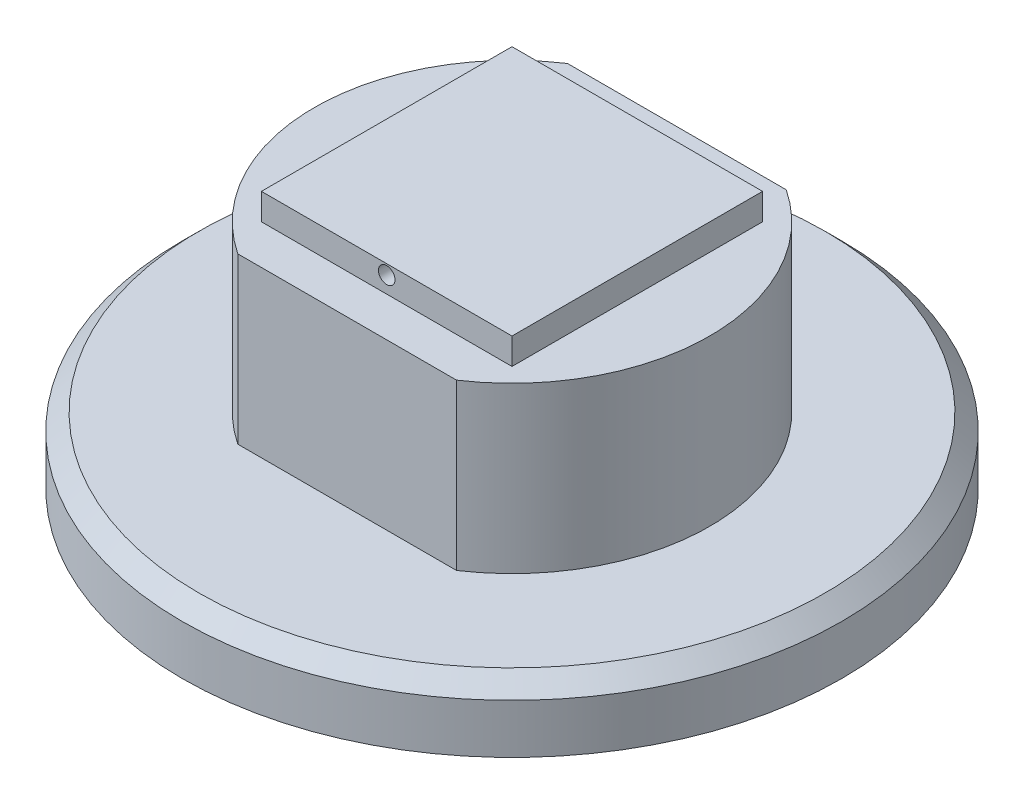
ISO-10303-21;
HEADER;
FILE_DESCRIPTION(('STEP AP214'),'2;1');
FILE_NAME('part.step','',(''),(''),'','','');
FILE_SCHEMA(('AUTOMOTIVE_DESIGN { 1 0 10303 214 1 1 1 1 }'));
ENDSEC;
DATA;
#1=APPLICATION_CONTEXT('core data for automotive mechanical design processes');
#2=APPLICATION_PROTOCOL_DEFINITION('international standard','automotive_design',2000,#1);
#3=PRODUCT_CONTEXT('',#1,'mechanical');
#4=PRODUCT('Part','Part','',(#3));
#5=PRODUCT_RELATED_PRODUCT_CATEGORY('part','',(#4));
#6=PRODUCT_DEFINITION_FORMATION('','',#4);
#7=PRODUCT_DEFINITION_CONTEXT('part definition',#1,'design');
#8=PRODUCT_DEFINITION('design','',#6,#7);
#9=PRODUCT_DEFINITION_SHAPE('','',#8);
#10=(LENGTH_UNIT() NAMED_UNIT(*) SI_UNIT(.MILLI.,.METRE.));
#11=(NAMED_UNIT(*) PLANE_ANGLE_UNIT() SI_UNIT($,.RADIAN.));
#12=(NAMED_UNIT(*) SI_UNIT($,.STERADIAN.) SOLID_ANGLE_UNIT());
#13=UNCERTAINTY_MEASURE_WITH_UNIT(LENGTH_MEASURE(1.E-05),#10,'distance_accuracy_value','');
#14=(GEOMETRIC_REPRESENTATION_CONTEXT(3) GLOBAL_UNCERTAINTY_ASSIGNED_CONTEXT((#13)) GLOBAL_UNIT_ASSIGNED_CONTEXT((#10,
#11,#12)) REPRESENTATION_CONTEXT('',''));
#15=CARTESIAN_POINT('',(0.,0.,0.));
#16=DIRECTION('',(0.,0.,1.));
#17=DIRECTION('',(1.,0.,0.));
#18=AXIS2_PLACEMENT_3D('',#15,#16,#17);
#19=CARTESIAN_POINT('',(0.,5.,0.));
#20=DIRECTION('',(0.,1.,0.));
#21=DIRECTION('',(0.,0.,1.));
#22=AXIS2_PLACEMENT_3D('',#19,#20,#21);
#23=PLANE('',#22);
#24=CARTESIAN_POINT('',(0.,5.,0.));
#25=DIRECTION('',(0.,1.,0.));
#26=DIRECTION('',(0.,0.,1.));
#27=AXIS2_PLACEMENT_3D('',#24,#25,#26);
#28=CIRCLE('',#27,6.);
#29=CARTESIAN_POINT('',(-3.3166247903554,5.,-5.));
#30=VERTEX_POINT('',#29);
#31=CARTESIAN_POINT('',(-3.3166247903554,5.,5.));
#32=VERTEX_POINT('',#31);
#33=EDGE_CURVE('E102',#30,#32,#28,.T.);
#34=ORIENTED_EDGE('',*,*,#33,.T.);
#35=DIRECTION('',(1.,0.,0.));
#36=VECTOR('',#35,1.);
#37=CARTESIAN_POINT('',(-3.3166247903554,5.,5.));
#38=LINE('',#37,#36);
#39=CARTESIAN_POINT('',(3.3166247903554,5.,5.));
#40=VERTEX_POINT('',#39);
#41=EDGE_CURVE('E95',#32,#40,#38,.T.);
#42=ORIENTED_EDGE('',*,*,#41,.T.);
#43=CARTESIAN_POINT('',(0.,5.,0.));
#44=DIRECTION('',(0.,1.,0.));
#45=DIRECTION('',(0.,0.,1.));
#46=AXIS2_PLACEMENT_3D('',#43,#44,#45);
#47=CIRCLE('',#46,6.);
#48=CARTESIAN_POINT('',(3.3166247903554,5.,-5.));
#49=VERTEX_POINT('',#48);
#50=EDGE_CURVE('E99',#40,#49,#47,.T.);
#51=ORIENTED_EDGE('',*,*,#50,.T.);
#52=DIRECTION('',(-1.,0.,0.));
#53=VECTOR('',#52,1.);
#54=CARTESIAN_POINT('',(-3.3166247903554,5.,-5.));
#55=LINE('',#54,#53);
#56=EDGE_CURVE('E56',#49,#30,#55,.T.);
#57=ORIENTED_EDGE('',*,*,#56,.T.);
#58=EDGE_LOOP('',(#34,#42,#51,#57));
#59=FACE_BOUND('',#58,.T.);
#60=DIRECTION('',(1.,0.,0.));
#61=VECTOR('',#60,1.);
#62=CARTESIAN_POINT('',(-3.8,5.,3.8));
#63=LINE('',#62,#61);
#64=CARTESIAN_POINT('',(-3.8,5.,3.8));
#65=VERTEX_POINT('',#64);
#66=CARTESIAN_POINT('',(3.8,5.,3.8));
#67=VERTEX_POINT('',#66);
#68=EDGE_CURVE('E305',#65,#67,#63,.T.);
#69=ORIENTED_EDGE('',*,*,#68,.F.);
#70=DIRECTION('',(0.,0.,1.));
#71=VECTOR('',#70,1.);
#72=CARTESIAN_POINT('',(-3.8,5.,-3.8));
#73=LINE('',#72,#71);
#74=CARTESIAN_POINT('',(-3.8,5.,-3.8));
#75=VERTEX_POINT('',#74);
#76=EDGE_CURVE('E138',#75,#65,#73,.T.);
#77=ORIENTED_EDGE('',*,*,#76,.F.);
#78=DIRECTION('',(-1.,0.,0.));
#79=VECTOR('',#78,1.);
#80=CARTESIAN_POINT('',(3.8,5.,-3.8));
#81=LINE('',#80,#79);
#82=CARTESIAN_POINT('',(3.8,5.,-3.8));
#83=VERTEX_POINT('',#82);
#84=EDGE_CURVE('E318',#83,#75,#81,.T.);
#85=ORIENTED_EDGE('',*,*,#84,.F.);
#86=DIRECTION('',(0.,0.,-1.));
#87=VECTOR('',#86,1.);
#88=CARTESIAN_POINT('',(3.8,5.,-3.8));
#89=LINE('',#88,#87);
#90=EDGE_CURVE('E316',#67,#83,#89,.T.);
#91=ORIENTED_EDGE('',*,*,#90,.F.);
#92=EDGE_LOOP('',(#69,#77,#85,#91));
#93=FACE_BOUND('',#92,.T.);
#94=ADVANCED_FACE('F32',(#59,#93),#23,.T.);
#95=CARTESIAN_POINT('',(0.,5.,0.));
#96=DIRECTION('',(0.,-1.,0.));
#97=DIRECTION('',(0.,0.,-1.));
#98=AXIS2_PLACEMENT_3D('',#95,#96,#97);
#99=CYLINDRICAL_SURFACE('',#98,6.);
#100=CARTESIAN_POINT('',(0.,0.,0.));
#101=DIRECTION('',(0.,1.,0.));
#102=DIRECTION('',(0.,0.,1.));
#103=AXIS2_PLACEMENT_3D('',#100,#101,#102);
#104=CIRCLE('',#103,6.);
#105=CARTESIAN_POINT('',(-3.3166247903554,0.,-5.));
#106=VERTEX_POINT('',#105);
#107=CARTESIAN_POINT('',(-3.3166247903554,0.,5.));
#108=VERTEX_POINT('',#107);
#109=EDGE_CURVE('E69',#106,#108,#104,.T.);
#110=ORIENTED_EDGE('',*,*,#109,.T.);
#111=DIRECTION('',(0.,-1.,0.));
#112=VECTOR('',#111,1.);
#113=CARTESIAN_POINT('',(-3.3166247903554,5.,5.));
#114=LINE('',#113,#112);
#115=EDGE_CURVE('E115',#32,#108,#114,.T.);
#116=ORIENTED_EDGE('',*,*,#115,.F.);
#117=ORIENTED_EDGE('',*,*,#33,.F.);
#118=DIRECTION('',(0.,-1.,0.));
#119=VECTOR('',#118,1.);
#120=CARTESIAN_POINT('',(-3.3166247903554,5.,-5.));
#121=LINE('',#120,#119);
#122=EDGE_CURVE('E121',#30,#106,#121,.T.);
#123=ORIENTED_EDGE('',*,*,#122,.T.);
#124=EDGE_LOOP('',(#110,#116,#117,#123));
#125=FACE_BOUND('',#124,.T.);
#126=ADVANCED_FACE('F156',(#125),#99,.T.);
#127=CARTESIAN_POINT('',(-3.3166247903554,5.,5.));
#128=DIRECTION('',(0.,0.,-1.));
#129=DIRECTION('',(-1.,0.,0.));
#130=AXIS2_PLACEMENT_3D('',#127,#128,#129);
#131=PLANE('',#130);
#132=DIRECTION('',(1.,0.,0.));
#133=VECTOR('',#132,1.);
#134=CARTESIAN_POINT('',(-3.3166247903554,0.,5.));
#135=LINE('',#134,#133);
#136=CARTESIAN_POINT('',(3.3166247903554,0.,5.));
#137=VERTEX_POINT('',#136);
#138=EDGE_CURVE('E112',#108,#137,#135,.T.);
#139=ORIENTED_EDGE('',*,*,#138,.T.);
#140=DIRECTION('',(0.,-1.,0.));
#141=VECTOR('',#140,1.);
#142=CARTESIAN_POINT('',(3.3166247903554,5.,5.));
#143=LINE('',#142,#141);
#144=EDGE_CURVE('E109',#40,#137,#143,.T.);
#145=ORIENTED_EDGE('',*,*,#144,.F.);
#146=ORIENTED_EDGE('',*,*,#41,.F.);
#147=ORIENTED_EDGE('',*,*,#115,.T.);
#148=EDGE_LOOP('',(#139,#145,#146,#147));
#149=FACE_BOUND('',#148,.T.);
#150=ADVANCED_FACE('F110',(#149),#131,.F.);
#151=CARTESIAN_POINT('',(0.,5.,0.));
#152=DIRECTION('',(0.,-1.,0.));
#153=DIRECTION('',(0.,0.,-1.));
#154=AXIS2_PLACEMENT_3D('',#151,#152,#153);
#155=CYLINDRICAL_SURFACE('',#154,6.);
#156=CARTESIAN_POINT('',(0.,0.,0.));
#157=DIRECTION('',(0.,1.,0.));
#158=DIRECTION('',(0.,0.,1.));
#159=AXIS2_PLACEMENT_3D('',#156,#157,#158);
#160=CIRCLE('',#159,6.);
#161=CARTESIAN_POINT('',(3.3166247903554,0.,-5.));
#162=VERTEX_POINT('',#161);
#163=EDGE_CURVE('E128',#137,#162,#160,.T.);
#164=ORIENTED_EDGE('',*,*,#163,.T.);
#165=DIRECTION('',(0.,-1.,0.));
#166=VECTOR('',#165,1.);
#167=CARTESIAN_POINT('',(3.3166247903554,5.,-5.));
#168=LINE('',#167,#166);
#169=EDGE_CURVE('E116',#49,#162,#168,.T.);
#170=ORIENTED_EDGE('',*,*,#169,.F.);
#171=ORIENTED_EDGE('',*,*,#50,.F.);
#172=ORIENTED_EDGE('',*,*,#144,.T.);
#173=EDGE_LOOP('',(#164,#170,#171,#172));
#174=FACE_BOUND('',#173,.T.);
#175=ADVANCED_FACE('F118',(#174),#155,.T.);
#176=CARTESIAN_POINT('',(-3.3166247903554,5.,-5.));
#177=DIRECTION('',(0.,0.,1.));
#178=DIRECTION('',(1.,0.,0.));
#179=AXIS2_PLACEMENT_3D('',#176,#177,#178);
#180=PLANE('',#179);
#181=DIRECTION('',(-1.,0.,0.));
#182=VECTOR('',#181,1.);
#183=CARTESIAN_POINT('',(-3.3166247903554,0.,-5.));
#184=LINE('',#183,#182);
#185=EDGE_CURVE('E130',#162,#106,#184,.T.);
#186=ORIENTED_EDGE('',*,*,#185,.T.);
#187=ORIENTED_EDGE('',*,*,#122,.F.);
#188=ORIENTED_EDGE('',*,*,#56,.F.);
#189=ORIENTED_EDGE('',*,*,#169,.T.);
#190=EDGE_LOOP('',(#186,#187,#188,#189));
#191=FACE_BOUND('',#190,.T.);
#192=ADVANCED_FACE('F166',(#191),#180,.F.);
#193=CARTESIAN_POINT('',(-3.8,5.8,-3.8));
#194=DIRECTION('',(1.,0.,0.));
#195=DIRECTION('',(0.,0.,-1.));
#196=AXIS2_PLACEMENT_3D('',#193,#194,#195);
#197=PLANE('',#196);
#198=ORIENTED_EDGE('',*,*,#76,.T.);
#199=DIRECTION('',(0.,-1.,0.));
#200=VECTOR('',#199,1.);
#201=CARTESIAN_POINT('',(-3.8,5.8,3.8));
#202=LINE('',#201,#200);
#203=CARTESIAN_POINT('',(-3.8,5.8,3.8));
#204=VERTEX_POINT('',#203);
#205=EDGE_CURVE('E126',#204,#65,#202,.T.);
#206=ORIENTED_EDGE('',*,*,#205,.F.);
#207=DIRECTION('',(0.,0.,1.));
#208=VECTOR('',#207,1.);
#209=CARTESIAN_POINT('',(-3.8,5.8,-3.8));
#210=LINE('',#209,#208);
#211=CARTESIAN_POINT('',(-3.8,5.8,-3.8));
#212=VERTEX_POINT('',#211);
#213=EDGE_CURVE('E298',#212,#204,#210,.T.);
#214=ORIENTED_EDGE('',*,*,#213,.F.);
#215=DIRECTION('',(0.,-1.,0.));
#216=VECTOR('',#215,1.);
#217=CARTESIAN_POINT('',(-3.8,5.8,-3.8));
#218=LINE('',#217,#216);
#219=EDGE_CURVE('E309',#212,#75,#218,.T.);
#220=ORIENTED_EDGE('',*,*,#219,.T.);
#221=EDGE_LOOP('',(#198,#206,#214,#220));
#222=FACE_BOUND('',#221,.T.);
#223=ADVANCED_FACE('F164',(#222),#197,.F.);
#224=CARTESIAN_POINT('',(-3.8,5.8,3.8));
#225=DIRECTION('',(0.,0.,-1.));
#226=DIRECTION('',(-1.,0.,0.));
#227=AXIS2_PLACEMENT_3D('',#224,#225,#226);
#228=PLANE('',#227);
#229=CARTESIAN_POINT('',(0.,5.5,3.8));
#230=DIRECTION('',(0.,0.,1.));
#231=DIRECTION('',(1.,0.,0.));
#232=AXIS2_PLACEMENT_3D('',#229,#230,#231);
#233=CIRCLE('',#232,0.25);
#234=CARTESIAN_POINT('',(0.250000000000001,5.5,3.8));
#235=VERTEX_POINT('',#234);
#236=EDGE_CURVE('E139',#235,#235,#233,.T.);
#237=ORIENTED_EDGE('',*,*,#236,.F.);
#238=EDGE_LOOP('',(#237));
#239=FACE_BOUND('',#238,.T.);
#240=ORIENTED_EDGE('',*,*,#68,.T.);
#241=DIRECTION('',(0.,-1.,0.));
#242=VECTOR('',#241,1.);
#243=CARTESIAN_POINT('',(3.8,5.8,3.8));
#244=LINE('',#243,#242);
#245=CARTESIAN_POINT('',(3.8,5.8,3.8));
#246=VERTEX_POINT('',#245);
#247=EDGE_CURVE('E303',#246,#67,#244,.T.);
#248=ORIENTED_EDGE('',*,*,#247,.F.);
#249=DIRECTION('',(1.,0.,0.));
#250=VECTOR('',#249,1.);
#251=CARTESIAN_POINT('',(-3.8,5.8,3.8));
#252=LINE('',#251,#250);
#253=EDGE_CURVE('E293',#204,#246,#252,.T.);
#254=ORIENTED_EDGE('',*,*,#253,.F.);
#255=ORIENTED_EDGE('',*,*,#205,.T.);
#256=EDGE_LOOP('',(#240,#248,#254,#255));
#257=FACE_BOUND('',#256,.T.);
#258=ADVANCED_FACE('F192',(#239,#257),#228,.F.);
#259=CARTESIAN_POINT('',(3.8,5.8,-3.8));
#260=DIRECTION('',(-1.,0.,0.));
#261=DIRECTION('',(0.,0.,1.));
#262=AXIS2_PLACEMENT_3D('',#259,#260,#261);
#263=PLANE('',#262);
#264=ORIENTED_EDGE('',*,*,#90,.T.);
#265=DIRECTION('',(0.,-1.,0.));
#266=VECTOR('',#265,1.);
#267=CARTESIAN_POINT('',(3.8,5.8,-3.8));
#268=LINE('',#267,#266);
#269=CARTESIAN_POINT('',(3.8,5.8,-3.8));
#270=VERTEX_POINT('',#269);
#271=EDGE_CURVE('E47',#270,#83,#268,.T.);
#272=ORIENTED_EDGE('',*,*,#271,.F.);
#273=DIRECTION('',(0.,0.,-1.));
#274=VECTOR('',#273,1.);
#275=CARTESIAN_POINT('',(3.8,5.8,-3.8));
#276=LINE('',#275,#274);
#277=EDGE_CURVE('E296',#246,#270,#276,.T.);
#278=ORIENTED_EDGE('',*,*,#277,.F.);
#279=ORIENTED_EDGE('',*,*,#247,.T.);
#280=EDGE_LOOP('',(#264,#272,#278,#279));
#281=FACE_BOUND('',#280,.T.);
#282=ADVANCED_FACE('F200',(#281),#263,.F.);
#283=CARTESIAN_POINT('',(3.8,5.8,-3.8));
#284=DIRECTION('',(0.,0.,1.));
#285=DIRECTION('',(1.,0.,0.));
#286=AXIS2_PLACEMENT_3D('',#283,#284,#285);
#287=PLANE('',#286);
#288=CARTESIAN_POINT('',(0.,5.5,-3.8));
#289=DIRECTION('',(0.,0.,1.));
#290=DIRECTION('',(1.,0.,0.));
#291=AXIS2_PLACEMENT_3D('',#288,#289,#290);
#292=CIRCLE('',#291,0.25);
#293=CARTESIAN_POINT('',(0.250000000000001,5.5,-3.8));
#294=VERTEX_POINT('',#293);
#295=EDGE_CURVE('E136',#294,#294,#292,.T.);
#296=ORIENTED_EDGE('',*,*,#295,.T.);
#297=EDGE_LOOP('',(#296));
#298=FACE_BOUND('',#297,.T.);
#299=ORIENTED_EDGE('',*,*,#84,.T.);
#300=ORIENTED_EDGE('',*,*,#219,.F.);
#301=DIRECTION('',(-1.,0.,0.));
#302=VECTOR('',#301,1.);
#303=CARTESIAN_POINT('',(3.8,5.8,-3.8));
#304=LINE('',#303,#302);
#305=EDGE_CURVE('E79',#270,#212,#304,.T.);
#306=ORIENTED_EDGE('',*,*,#305,.F.);
#307=ORIENTED_EDGE('',*,*,#271,.T.);
#308=EDGE_LOOP('',(#299,#300,#306,#307));
#309=FACE_BOUND('',#308,.T.);
#310=ADVANCED_FACE('F208',(#298,#309),#287,.F.);
#311=CARTESIAN_POINT('',(0.,5.8,0.));
#312=DIRECTION('',(0.,1.,0.));
#313=DIRECTION('',(0.,0.,1.));
#314=AXIS2_PLACEMENT_3D('',#311,#312,#313);
#315=PLANE('',#314);
#316=ORIENTED_EDGE('',*,*,#213,.T.);
#317=ORIENTED_EDGE('',*,*,#253,.T.);
#318=ORIENTED_EDGE('',*,*,#277,.T.);
#319=ORIENTED_EDGE('',*,*,#305,.T.);
#320=EDGE_LOOP('',(#316,#317,#318,#319));
#321=FACE_BOUND('',#320,.T.);
#322=ADVANCED_FACE('F215',(#321),#315,.T.);
#323=CARTESIAN_POINT('',(0.,5.5,-5.));
#324=DIRECTION('',(0.,0.,1.));
#325=DIRECTION('',(1.,0.,0.));
#326=AXIS2_PLACEMENT_3D('',#323,#324,#325);
#327=CYLINDRICAL_SURFACE('',#326,0.25);
#328=ORIENTED_EDGE('',*,*,#236,.T.);
#329=EDGE_LOOP('',(#328));
#330=FACE_BOUND('',#329,.T.);
#331=ORIENTED_EDGE('',*,*,#295,.F.);
#332=EDGE_LOOP('',(#331));
#333=FACE_BOUND('',#332,.T.);
#334=ADVANCED_FACE('F223',(#330,#333),#327,.F.);
#335=CARTESIAN_POINT('',(0.,0.,0.));
#336=DIRECTION('',(0.,-1.,0.));
#337=DIRECTION('',(0.,0.,-1.));
#338=AXIS2_PLACEMENT_3D('',#335,#336,#337);
#339=PLANE('',#338);
#340=CARTESIAN_POINT('',(0.,0.,0.));
#341=DIRECTION('',(0.,-1.,0.));
#342=DIRECTION('',(0.,0.,-1.));
#343=AXIS2_PLACEMENT_3D('',#340,#341,#342);
#344=CIRCLE('',#343,9.5);
#345=CARTESIAN_POINT('',(0.,0.,-9.5));
#346=VERTEX_POINT('',#345);
#347=EDGE_CURVE('E11',#346,#346,#344,.F.);
#348=ORIENTED_EDGE('',*,*,#347,.T.);
#349=EDGE_LOOP('',(#348));
#350=FACE_BOUND('',#349,.T.);
#351=ORIENTED_EDGE('',*,*,#138,.F.);
#352=ORIENTED_EDGE('',*,*,#109,.F.);
#353=ORIENTED_EDGE('',*,*,#185,.F.);
#354=ORIENTED_EDGE('',*,*,#163,.F.);
#355=EDGE_LOOP('',(#351,#352,#353,#354));
#356=FACE_BOUND('',#355,.T.);
#357=ADVANCED_FACE('F229',(#350,#356),#339,.F.);
#358=CARTESIAN_POINT('',(0.,-2.,0.));
#359=DIRECTION('',(0.,1.,0.));
#360=DIRECTION('',(0.,0.,1.));
#361=AXIS2_PLACEMENT_3D('',#358,#359,#360);
#362=CYLINDRICAL_SURFACE('',#361,10.);
#363=CARTESIAN_POINT('',(0.,-0.500000000000004,0.));
#364=DIRECTION('',(0.,-1.,0.));
#365=DIRECTION('',(0.,0.,-1.));
#366=AXIS2_PLACEMENT_3D('',#363,#364,#365);
#367=CIRCLE('',#366,10.);
#368=CARTESIAN_POINT('',(0.,-0.500000000000004,-10.));
#369=VERTEX_POINT('',#368);
#370=EDGE_CURVE('E40',#369,#369,#367,.T.);
#371=ORIENTED_EDGE('',*,*,#370,.T.);
#372=EDGE_LOOP('',(#371));
#373=FACE_BOUND('',#372,.T.);
#374=CARTESIAN_POINT('',(0.,-2.,0.));
#375=DIRECTION('',(0.,-1.,0.));
#376=DIRECTION('',(0.,0.,-1.));
#377=AXIS2_PLACEMENT_3D('',#374,#375,#376);
#378=CIRCLE('',#377,10.);
#379=CARTESIAN_POINT('',(0.,-2.,-10.));
#380=VERTEX_POINT('',#379);
#381=EDGE_CURVE('E328',#380,#380,#378,.T.);
#382=ORIENTED_EDGE('',*,*,#381,.F.);
#383=EDGE_LOOP('',(#382));
#384=FACE_BOUND('',#383,.T.);
#385=ADVANCED_FACE('F143',(#373,#384),#362,.T.);
#386=CARTESIAN_POINT('',(0.,-2.,0.));
#387=DIRECTION('',(0.,-1.,0.));
#388=DIRECTION('',(0.,0.,-1.));
#389=AXIS2_PLACEMENT_3D('',#386,#387,#388);
#390=PLANE('',#389);
#391=ORIENTED_EDGE('',*,*,#381,.T.);
#392=EDGE_LOOP('',(#391));
#393=FACE_BOUND('',#392,.T.);
#394=ADVANCED_FACE('F147',(#393),#390,.T.);
#395=CARTESIAN_POINT('',(0.,-0.500000000000004,0.));
#396=DIRECTION('',(0.,-1.,0.));
#397=DIRECTION('',(0.,0.,-1.));
#398=AXIS2_PLACEMENT_3D('',#395,#396,#397);
#399=CONICAL_SURFACE('',#398,10.,0.785398163397448);
#400=ORIENTED_EDGE('',*,*,#347,.F.);
#401=EDGE_LOOP('',(#400));
#402=FACE_BOUND('',#401,.T.);
#403=ORIENTED_EDGE('',*,*,#370,.F.);
#404=EDGE_LOOP('',(#403));
#405=FACE_BOUND('',#404,.T.);
#406=ADVANCED_FACE('F34',(#402,#405),#399,.T.);
#407=CLOSED_SHELL('',(#94,#126,#150,#175,#192,#223,#258,#282,#310,#322,#334,#357,#385,#394,#406));
#408=MANIFOLD_SOLID_BREP('B2',#407);
#409=ADVANCED_BREP_SHAPE_REPRESENTATION('',(#18,#408),#14);
#410=SHAPE_DEFINITION_REPRESENTATION(#9,#409);
ENDSEC;
END-ISO-10303-21;
